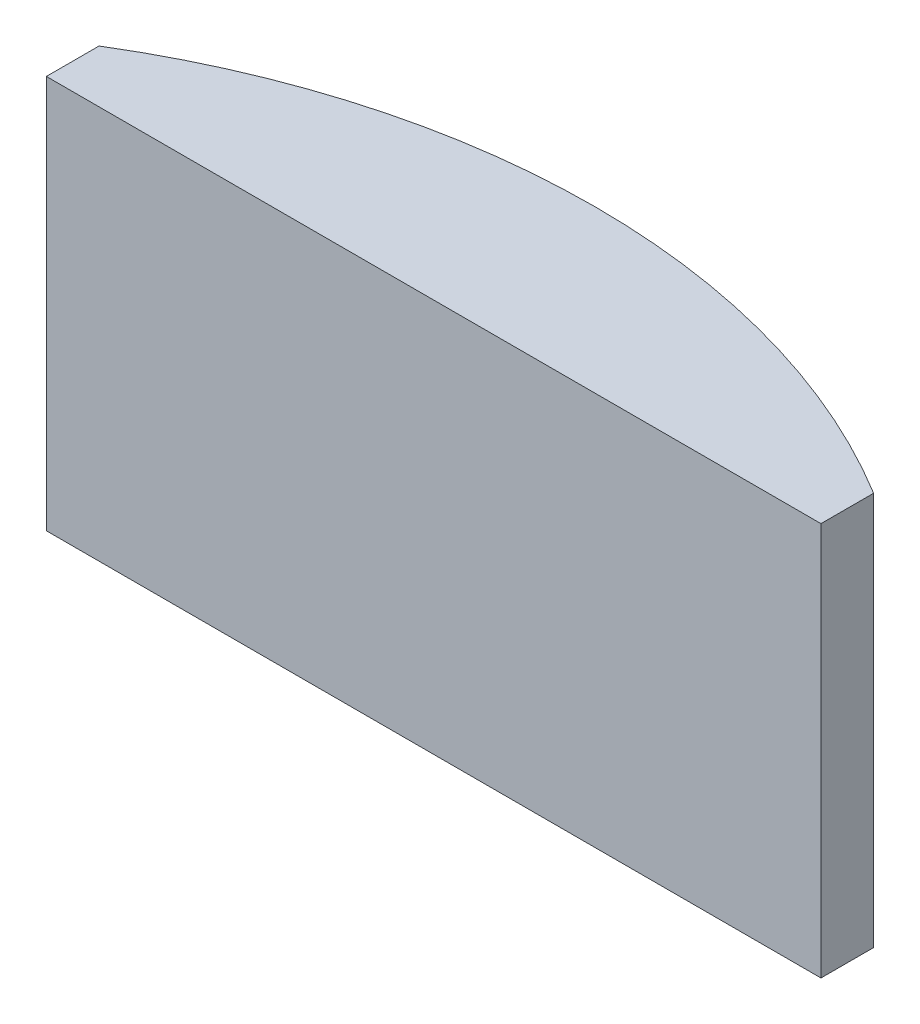
ISO-10303-21;
HEADER;
FILE_DESCRIPTION(('STEP AP214'),'2;1');
FILE_NAME('part.step','',(''),(''),'','','');
FILE_SCHEMA(('AUTOMOTIVE_DESIGN { 1 0 10303 214 1 1 1 1 }'));
ENDSEC;
DATA;
#1=APPLICATION_CONTEXT('core data for automotive mechanical design processes');
#2=APPLICATION_PROTOCOL_DEFINITION('international standard','automotive_design',2000,#1);
#3=PRODUCT_CONTEXT('',#1,'mechanical');
#4=PRODUCT('Part','Part','',(#3));
#5=PRODUCT_RELATED_PRODUCT_CATEGORY('part','',(#4));
#6=PRODUCT_DEFINITION_FORMATION('','',#4);
#7=PRODUCT_DEFINITION_CONTEXT('part definition',#1,'design');
#8=PRODUCT_DEFINITION('design','',#6,#7);
#9=PRODUCT_DEFINITION_SHAPE('','',#8);
#10=(LENGTH_UNIT() NAMED_UNIT(*) SI_UNIT(.MILLI.,.METRE.));
#11=(NAMED_UNIT(*) PLANE_ANGLE_UNIT() SI_UNIT($,.RADIAN.));
#12=(NAMED_UNIT(*) SI_UNIT($,.STERADIAN.) SOLID_ANGLE_UNIT());
#13=UNCERTAINTY_MEASURE_WITH_UNIT(LENGTH_MEASURE(1.E-05),#10,'distance_accuracy_value','');
#14=(GEOMETRIC_REPRESENTATION_CONTEXT(3) GLOBAL_UNCERTAINTY_ASSIGNED_CONTEXT((#13)) GLOBAL_UNIT_ASSIGNED_CONTEXT((#10,
#11,#12)) REPRESENTATION_CONTEXT('',''));
#15=CARTESIAN_POINT('',(0.,0.,0.));
#16=DIRECTION('',(0.,0.,1.));
#17=DIRECTION('',(1.,0.,0.));
#18=AXIS2_PLACEMENT_3D('',#15,#16,#17);
#19=CARTESIAN_POINT('',(0.,6.35,0.));
#20=DIRECTION('',(0.,-1.,0.));
#21=DIRECTION('',(0.,0.,-1.));
#22=AXIS2_PLACEMENT_3D('',#19,#20,#21);
#23=CYLINDRICAL_SURFACE('',#22,24.);
#24=CARTESIAN_POINT('',(0.,-6.35,0.));
#25=DIRECTION('',(0.,1.,0.));
#26=DIRECTION('',(0.,0.,-1.));
#27=AXIS2_PLACEMENT_3D('',#24,#25,#26);
#28=CIRCLE('',#27,24.);
#29=CARTESIAN_POINT('',(12.5,-6.35,-20.4878012485479));
#30=VERTEX_POINT('',#29);
#31=CARTESIAN_POINT('',(-12.5,-6.35,-20.4878012485479));
#32=VERTEX_POINT('',#31);
#33=EDGE_CURVE('E92',#30,#32,#28,.T.);
#34=ORIENTED_EDGE('',*,*,#33,.T.);
#35=DIRECTION('',(0.,-1.,0.));
#36=VECTOR('',#35,1.);
#37=CARTESIAN_POINT('',(-12.5,6.35,-20.4878012485479));
#38=LINE('',#37,#36);
#39=CARTESIAN_POINT('',(-12.5,6.35,-20.4878012485479));
#40=VERTEX_POINT('',#39);
#41=EDGE_CURVE('E11',#40,#32,#38,.T.);
#42=ORIENTED_EDGE('',*,*,#41,.F.);
#43=CARTESIAN_POINT('',(0.,6.35,0.));
#44=DIRECTION('',(0.,1.,0.));
#45=DIRECTION('',(0.,0.,-1.));
#46=AXIS2_PLACEMENT_3D('',#43,#44,#45);
#47=CIRCLE('',#46,24.);
#48=CARTESIAN_POINT('',(12.5,6.35,-20.4878012485479));
#49=VERTEX_POINT('',#48);
#50=EDGE_CURVE('E50',#49,#40,#47,.T.);
#51=ORIENTED_EDGE('',*,*,#50,.F.);
#52=DIRECTION('',(0.,-1.,0.));
#53=VECTOR('',#52,1.);
#54=CARTESIAN_POINT('',(12.5,6.35,-20.4878012485479));
#55=LINE('',#54,#53);
#56=EDGE_CURVE('E43',#49,#30,#55,.T.);
#57=ORIENTED_EDGE('',*,*,#56,.T.);
#58=EDGE_LOOP('',(#34,#42,#51,#57));
#59=FACE_BOUND('',#58,.T.);
#60=ADVANCED_FACE('F35',(#59),#23,.T.);
#61=CARTESIAN_POINT('',(0.,6.35,0.));
#62=DIRECTION('',(0.,-1.,0.));
#63=DIRECTION('',(0.,0.,-1.));
#64=AXIS2_PLACEMENT_3D('',#61,#62,#63);
#65=PLANE('',#64);
#66=ORIENTED_EDGE('',*,*,#50,.T.);
#67=DIRECTION('',(0.,0.,-1.));
#68=VECTOR('',#67,1.);
#69=CARTESIAN_POINT('',(-12.5,6.35,-18.7878012485479));
#70=LINE('',#69,#68);
#71=CARTESIAN_POINT('',(-12.5,6.35,-18.7878012485479));
#72=VERTEX_POINT('',#71);
#73=EDGE_CURVE('E77',#72,#40,#70,.T.);
#74=ORIENTED_EDGE('',*,*,#73,.F.);
#75=DIRECTION('',(-1.,0.,0.));
#76=VECTOR('',#75,1.);
#77=CARTESIAN_POINT('',(-12.5,6.35,-18.7878012485479));
#78=LINE('',#77,#76);
#79=CARTESIAN_POINT('',(12.5,6.35,-18.7878012485479));
#80=VERTEX_POINT('',#79);
#81=EDGE_CURVE('E70',#80,#72,#78,.T.);
#82=ORIENTED_EDGE('',*,*,#81,.F.);
#83=DIRECTION('',(0.,0.,-1.));
#84=VECTOR('',#83,1.);
#85=CARTESIAN_POINT('',(12.5,6.35,-18.7878012485479));
#86=LINE('',#85,#84);
#87=EDGE_CURVE('E74',#80,#49,#86,.T.);
#88=ORIENTED_EDGE('',*,*,#87,.T.);
#89=EDGE_LOOP('',(#66,#74,#82,#88));
#90=FACE_BOUND('',#89,.T.);
#91=ADVANCED_FACE('F72',(#90),#65,.F.);
#92=CARTESIAN_POINT('',(0.,-6.35,0.));
#93=DIRECTION('',(0.,-1.,0.));
#94=DIRECTION('',(0.,0.,-1.));
#95=AXIS2_PLACEMENT_3D('',#92,#93,#94);
#96=PLANE('',#95);
#97=ORIENTED_EDGE('',*,*,#33,.F.);
#98=DIRECTION('',(0.,0.,-1.));
#99=VECTOR('',#98,1.);
#100=CARTESIAN_POINT('',(12.5,-6.35,-18.7878012485479));
#101=LINE('',#100,#99);
#102=CARTESIAN_POINT('',(12.5,-6.35,-18.7878012485479));
#103=VERTEX_POINT('',#102);
#104=EDGE_CURVE('E100',#103,#30,#101,.T.);
#105=ORIENTED_EDGE('',*,*,#104,.F.);
#106=DIRECTION('',(1.,0.,0.));
#107=VECTOR('',#106,1.);
#108=CARTESIAN_POINT('',(-12.5,-6.35,-18.7878012485479));
#109=LINE('',#108,#107);
#110=CARTESIAN_POINT('',(-12.5,-6.35,-18.7878012485479));
#111=VERTEX_POINT('',#110);
#112=EDGE_CURVE('E86',#111,#103,#109,.T.);
#113=ORIENTED_EDGE('',*,*,#112,.F.);
#114=DIRECTION('',(0.,0.,-1.));
#115=VECTOR('',#114,1.);
#116=CARTESIAN_POINT('',(-12.5,-6.35,-18.7878012485479));
#117=LINE('',#116,#115);
#118=EDGE_CURVE('E96',#111,#32,#117,.T.);
#119=ORIENTED_EDGE('',*,*,#118,.T.);
#120=EDGE_LOOP('',(#97,#105,#113,#119));
#121=FACE_BOUND('',#120,.T.);
#122=ADVANCED_FACE('F109',(#121),#96,.T.);
#123=CARTESIAN_POINT('',(12.5,-6.35,-18.7878012485479));
#124=DIRECTION('',(-1.,0.,0.));
#125=DIRECTION('',(0.,0.,1.));
#126=AXIS2_PLACEMENT_3D('',#123,#124,#125);
#127=PLANE('',#126);
#128=ORIENTED_EDGE('',*,*,#56,.F.);
#129=ORIENTED_EDGE('',*,*,#87,.F.);
#130=DIRECTION('',(0.,1.,0.));
#131=VECTOR('',#130,1.);
#132=CARTESIAN_POINT('',(12.5,-6.35,-18.7878012485479));
#133=LINE('',#132,#131);
#134=EDGE_CURVE('E81',#103,#80,#133,.T.);
#135=ORIENTED_EDGE('',*,*,#134,.F.);
#136=ORIENTED_EDGE('',*,*,#104,.T.);
#137=EDGE_LOOP('',(#128,#129,#135,#136));
#138=FACE_BOUND('',#137,.T.);
#139=ADVANCED_FACE('F91',(#138),#127,.F.);
#140=CARTESIAN_POINT('',(-12.5,-6.35,-18.7878012485479));
#141=DIRECTION('',(1.,0.,0.));
#142=DIRECTION('',(0.,0.,-1.));
#143=AXIS2_PLACEMENT_3D('',#140,#141,#142);
#144=PLANE('',#143);
#145=ORIENTED_EDGE('',*,*,#41,.T.);
#146=ORIENTED_EDGE('',*,*,#118,.F.);
#147=DIRECTION('',(0.,-1.,0.));
#148=VECTOR('',#147,1.);
#149=CARTESIAN_POINT('',(-12.5,-6.35,-18.7878012485479));
#150=LINE('',#149,#148);
#151=EDGE_CURVE('E80',#72,#111,#150,.T.);
#152=ORIENTED_EDGE('',*,*,#151,.F.);
#153=ORIENTED_EDGE('',*,*,#73,.T.);
#154=EDGE_LOOP('',(#145,#146,#152,#153));
#155=FACE_BOUND('',#154,.T.);
#156=ADVANCED_FACE('F108',(#155),#144,.F.);
#157=CARTESIAN_POINT('',(0.,0.,-18.7878012485479));
#158=DIRECTION('',(0.,0.,-1.));
#159=DIRECTION('',(-1.,0.,0.));
#160=AXIS2_PLACEMENT_3D('',#157,#158,#159);
#161=PLANE('',#160);
#162=ORIENTED_EDGE('',*,*,#134,.T.);
#163=ORIENTED_EDGE('',*,*,#81,.T.);
#164=ORIENTED_EDGE('',*,*,#151,.T.);
#165=ORIENTED_EDGE('',*,*,#112,.T.);
#166=EDGE_LOOP('',(#162,#163,#164,#165));
#167=FACE_BOUND('',#166,.T.);
#168=ADVANCED_FACE('F84',(#167),#161,.F.);
#169=CLOSED_SHELL('',(#60,#91,#122,#139,#156,#168));
#170=MANIFOLD_SOLID_BREP('B2',#169);
#171=ADVANCED_BREP_SHAPE_REPRESENTATION('',(#18,#170),#14);
#172=SHAPE_DEFINITION_REPRESENTATION(#9,#171);
ENDSEC;
END-ISO-10303-21;
